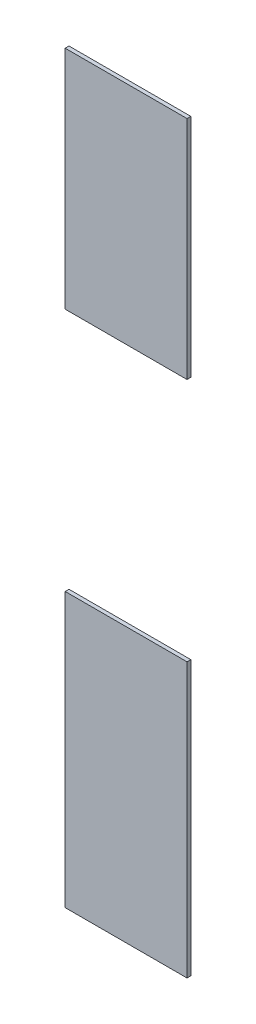
ISO-10303-21;
HEADER;
FILE_DESCRIPTION(('STEP AP214'),'2;1');
FILE_NAME('part.step','',(''),(''),'','','');
FILE_SCHEMA(('AUTOMOTIVE_DESIGN { 1 0 10303 214 1 1 1 1 }'));
ENDSEC;
DATA;
#1=APPLICATION_CONTEXT('core data for automotive mechanical design processes');
#2=APPLICATION_PROTOCOL_DEFINITION('international standard','automotive_design',2000,#1);
#3=PRODUCT_CONTEXT('',#1,'mechanical');
#4=PRODUCT('Part','Part','',(#3));
#5=PRODUCT_RELATED_PRODUCT_CATEGORY('part','',(#4));
#6=PRODUCT_DEFINITION_FORMATION('','',#4);
#7=PRODUCT_DEFINITION_CONTEXT('part definition',#1,'design');
#8=PRODUCT_DEFINITION('design','',#6,#7);
#9=PRODUCT_DEFINITION_SHAPE('','',#8);
#10=(LENGTH_UNIT() NAMED_UNIT(*) SI_UNIT(.MILLI.,.METRE.));
#11=(NAMED_UNIT(*) PLANE_ANGLE_UNIT() SI_UNIT($,.RADIAN.));
#12=(NAMED_UNIT(*) SI_UNIT($,.STERADIAN.) SOLID_ANGLE_UNIT());
#13=UNCERTAINTY_MEASURE_WITH_UNIT(LENGTH_MEASURE(1.E-05),#10,'distance_accuracy_value','');
#14=(GEOMETRIC_REPRESENTATION_CONTEXT(3) GLOBAL_UNCERTAINTY_ASSIGNED_CONTEXT((#13)) GLOBAL_UNIT_ASSIGNED_CONTEXT((#10,
#11,#12)) REPRESENTATION_CONTEXT('',''));
#15=CARTESIAN_POINT('',(0.,0.,0.));
#16=DIRECTION('',(0.,0.,1.));
#17=DIRECTION('',(1.,0.,0.));
#18=AXIS2_PLACEMENT_3D('',#15,#16,#17);
#19=CARTESIAN_POINT('',(-5.87409612295441E-13,-2444.25,12.5));
#20=DIRECTION('',(1.,0.,0.));
#21=DIRECTION('',(0.,1.,0.));
#22=AXIS2_PLACEMENT_3D('',#19,#20,#21);
#23=PLANE('',#22);
#24=DIRECTION('',(0.,-1.,0.));
#25=VECTOR('',#24,1.);
#26=CARTESIAN_POINT('',(-5.87409612295441E-13,-2444.25,0.));
#27=LINE('',#26,#25);
#28=CARTESIAN_POINT('',(-3.02914962235245E-13,-1545.,0.));
#29=VERTEX_POINT('',#28);
#30=CARTESIAN_POINT('',(-5.87409612295441E-13,-2444.25,0.));
#31=VERTEX_POINT('',#30);
#32=EDGE_CURVE('E107',#29,#31,#27,.T.);
#33=ORIENTED_EDGE('',*,*,#32,.T.);
#34=DIRECTION('',(0.,0.,-1.));
#35=VECTOR('',#34,1.);
#36=CARTESIAN_POINT('',(-5.87409612295441E-13,-2444.25,12.5));
#37=LINE('',#36,#35);
#38=CARTESIAN_POINT('',(-5.87409612295441E-13,-2444.25,12.5));
#39=VERTEX_POINT('',#38);
#40=EDGE_CURVE('E12',#39,#31,#37,.T.);
#41=ORIENTED_EDGE('',*,*,#40,.F.);
#42=DIRECTION('',(0.,-1.,0.));
#43=VECTOR('',#42,1.);
#44=CARTESIAN_POINT('',(-5.87409612295441E-13,-2444.25,12.5));
#45=LINE('',#44,#43);
#46=CARTESIAN_POINT('',(-3.02914962235245E-13,-1545.,12.5));
#47=VERTEX_POINT('',#46);
#48=EDGE_CURVE('E95',#47,#39,#45,.T.);
#49=ORIENTED_EDGE('',*,*,#48,.F.);
#50=DIRECTION('',(0.,0.,-1.));
#51=VECTOR('',#50,1.);
#52=CARTESIAN_POINT('',(-3.02914962235245E-13,-1545.,12.5));
#53=LINE('',#52,#51);
#54=EDGE_CURVE('E103',#47,#29,#53,.T.);
#55=ORIENTED_EDGE('',*,*,#54,.T.);
#56=EDGE_LOOP('',(#33,#41,#49,#55));
#57=FACE_BOUND('',#56,.T.);
#58=ADVANCED_FACE('F44',(#57),#23,.F.);
#59=CARTESIAN_POINT('',(-5.87409612295441E-13,-2444.25,12.5));
#60=DIRECTION('',(0.,1.,0.));
#61=DIRECTION('',(0.,0.,1.));
#62=AXIS2_PLACEMENT_3D('',#59,#60,#61);
#63=PLANE('',#62);
#64=DIRECTION('',(1.,0.,0.));
#65=VECTOR('',#64,1.);
#66=CARTESIAN_POINT('',(-5.87409612295441E-13,-2444.25,0.));
#67=LINE('',#66,#65);
#68=CARTESIAN_POINT('',(400.,-2444.25,0.));
#69=VERTEX_POINT('',#68);
#70=EDGE_CURVE('E99',#31,#69,#67,.T.);
#71=ORIENTED_EDGE('',*,*,#70,.T.);
#72=DIRECTION('',(0.,0.,-1.));
#73=VECTOR('',#72,1.);
#74=CARTESIAN_POINT('',(400.,-2444.25,12.5));
#75=LINE('',#74,#73);
#76=CARTESIAN_POINT('',(400.,-2444.25,12.5));
#77=VERTEX_POINT('',#76);
#78=EDGE_CURVE('E52',#77,#69,#75,.T.);
#79=ORIENTED_EDGE('',*,*,#78,.F.);
#80=DIRECTION('',(1.,0.,0.));
#81=VECTOR('',#80,1.);
#82=CARTESIAN_POINT('',(-5.87409612295441E-13,-2444.25,12.5));
#83=LINE('',#82,#81);
#84=EDGE_CURVE('E90',#39,#77,#83,.T.);
#85=ORIENTED_EDGE('',*,*,#84,.F.);
#86=ORIENTED_EDGE('',*,*,#40,.T.);
#87=EDGE_LOOP('',(#71,#79,#85,#86));
#88=FACE_BOUND('',#87,.T.);
#89=ADVANCED_FACE('F98',(#88),#63,.F.);
#90=CARTESIAN_POINT('',(400.,-2444.25,12.5));
#91=DIRECTION('',(-1.,0.,0.));
#92=DIRECTION('',(0.,0.,1.));
#93=AXIS2_PLACEMENT_3D('',#90,#91,#92);
#94=PLANE('',#93);
#95=DIRECTION('',(0.,1.,0.));
#96=VECTOR('',#95,1.);
#97=CARTESIAN_POINT('',(400.,-2444.25,0.));
#98=LINE('',#97,#96);
#99=CARTESIAN_POINT('',(400.,-1545.,0.));
#100=VERTEX_POINT('',#99);
#101=EDGE_CURVE('E77',#69,#100,#98,.T.);
#102=ORIENTED_EDGE('',*,*,#101,.T.);
#103=DIRECTION('',(0.,0.,-1.));
#104=VECTOR('',#103,1.);
#105=CARTESIAN_POINT('',(400.,-1545.,12.5));
#106=LINE('',#105,#104);
#107=CARTESIAN_POINT('',(400.,-1545.,12.5));
#108=VERTEX_POINT('',#107);
#109=EDGE_CURVE('E100',#108,#100,#106,.T.);
#110=ORIENTED_EDGE('',*,*,#109,.F.);
#111=DIRECTION('',(0.,1.,0.));
#112=VECTOR('',#111,1.);
#113=CARTESIAN_POINT('',(400.,-2444.25,12.5));
#114=LINE('',#113,#112);
#115=EDGE_CURVE('E93',#77,#108,#114,.T.);
#116=ORIENTED_EDGE('',*,*,#115,.F.);
#117=ORIENTED_EDGE('',*,*,#78,.T.);
#118=EDGE_LOOP('',(#102,#110,#116,#117));
#119=FACE_BOUND('',#118,.T.);
#120=ADVANCED_FACE('F101',(#119),#94,.F.);
#121=CARTESIAN_POINT('',(-3.02914962235245E-13,-1545.,12.5));
#122=DIRECTION('',(0.,-1.,0.));
#123=DIRECTION('',(0.,0.,-1.));
#124=AXIS2_PLACEMENT_3D('',#121,#122,#123);
#125=PLANE('',#124);
#126=DIRECTION('',(-1.,0.,0.));
#127=VECTOR('',#126,1.);
#128=CARTESIAN_POINT('',(-3.02914962235245E-13,-1545.,0.));
#129=LINE('',#128,#127);
#130=EDGE_CURVE('E83',#100,#29,#129,.T.);
#131=ORIENTED_EDGE('',*,*,#130,.T.);
#132=ORIENTED_EDGE('',*,*,#54,.F.);
#133=DIRECTION('',(-1.,0.,0.));
#134=VECTOR('',#133,1.);
#135=CARTESIAN_POINT('',(-3.02914962235245E-13,-1545.,12.5));
#136=LINE('',#135,#134);
#137=EDGE_CURVE('E60',#108,#47,#136,.T.);
#138=ORIENTED_EDGE('',*,*,#137,.F.);
#139=ORIENTED_EDGE('',*,*,#109,.T.);
#140=EDGE_LOOP('',(#131,#132,#138,#139));
#141=FACE_BOUND('',#140,.T.);
#142=ADVANCED_FACE('F114',(#141),#125,.F.);
#143=CARTESIAN_POINT('',(0.,0.,12.5));
#144=DIRECTION('',(0.,0.,-1.));
#145=DIRECTION('',(-1.,0.,0.));
#146=AXIS2_PLACEMENT_3D('',#143,#144,#145);
#147=PLANE('',#146);
#148=ORIENTED_EDGE('',*,*,#48,.T.);
#149=ORIENTED_EDGE('',*,*,#84,.T.);
#150=ORIENTED_EDGE('',*,*,#115,.T.);
#151=ORIENTED_EDGE('',*,*,#137,.T.);
#152=EDGE_LOOP('',(#148,#149,#150,#151));
#153=FACE_BOUND('',#152,.T.);
#154=ADVANCED_FACE('F91',(#153),#147,.F.);
#155=CARTESIAN_POINT('',(0.,0.,0.));
#156=DIRECTION('',(0.,0.,-1.));
#157=DIRECTION('',(-1.,0.,0.));
#158=AXIS2_PLACEMENT_3D('',#155,#156,#157);
#159=PLANE('',#158);
#160=ORIENTED_EDGE('',*,*,#32,.F.);
#161=ORIENTED_EDGE('',*,*,#130,.F.);
#162=ORIENTED_EDGE('',*,*,#101,.F.);
#163=ORIENTED_EDGE('',*,*,#70,.F.);
#164=EDGE_LOOP('',(#160,#161,#162,#163));
#165=FACE_BOUND('',#164,.T.);
#166=ADVANCED_FACE('F117',(#165),#159,.T.);
#167=CLOSED_SHELL('',(#58,#89,#120,#142,#154,#166));
#168=MANIFOLD_SOLID_BREP('B2',#167);
#169=CARTESIAN_POINT('',(0.,0.,12.5));
#170=DIRECTION('',(1.,0.,0.));
#171=DIRECTION('',(0.,1.,0.));
#172=AXIS2_PLACEMENT_3D('',#169,#170,#171);
#173=PLANE('',#172);
#174=DIRECTION('',(0.,-1.,0.));
#175=VECTOR('',#174,1.);
#176=CARTESIAN_POINT('',(0.,0.,0.));
#177=LINE('',#176,#175);
#178=CARTESIAN_POINT('',(0.,0.,0.));
#179=VERTEX_POINT('',#178);
#180=CARTESIAN_POINT('',(0.,-742.249999999999,0.));
#181=VERTEX_POINT('',#180);
#182=EDGE_CURVE('E230',#179,#181,#177,.T.);
#183=ORIENTED_EDGE('',*,*,#182,.T.);
#184=DIRECTION('',(0.,0.,-1.));
#185=VECTOR('',#184,1.);
#186=CARTESIAN_POINT('',(0.,-742.249999999999,12.5));
#187=LINE('',#186,#185);
#188=CARTESIAN_POINT('',(0.,-742.249999999999,12.5));
#189=VERTEX_POINT('',#188);
#190=EDGE_CURVE('E42',#189,#181,#187,.T.);
#191=ORIENTED_EDGE('',*,*,#190,.F.);
#192=DIRECTION('',(0.,-1.,0.));
#193=VECTOR('',#192,1.);
#194=CARTESIAN_POINT('',(0.,0.,12.5));
#195=LINE('',#194,#193);
#196=CARTESIAN_POINT('',(0.,0.,12.5));
#197=VERTEX_POINT('',#196);
#198=EDGE_CURVE('E218',#197,#189,#195,.T.);
#199=ORIENTED_EDGE('',*,*,#198,.F.);
#200=DIRECTION('',(0.,0.,-1.));
#201=VECTOR('',#200,1.);
#202=CARTESIAN_POINT('',(0.,0.,12.5));
#203=LINE('',#202,#201);
#204=EDGE_CURVE('E226',#197,#179,#203,.T.);
#205=ORIENTED_EDGE('',*,*,#204,.T.);
#206=EDGE_LOOP('',(#183,#191,#199,#205));
#207=FACE_BOUND('',#206,.T.);
#208=ADVANCED_FACE('F167',(#207),#173,.F.);
#209=CARTESIAN_POINT('',(0.,-742.249999999999,12.5));
#210=DIRECTION('',(0.,1.,0.));
#211=DIRECTION('',(0.,0.,1.));
#212=AXIS2_PLACEMENT_3D('',#209,#210,#211);
#213=PLANE('',#212);
#214=DIRECTION('',(1.,0.,0.));
#215=VECTOR('',#214,1.);
#216=CARTESIAN_POINT('',(0.,-742.249999999999,0.));
#217=LINE('',#216,#215);
#218=CARTESIAN_POINT('',(399.999999999999,-742.249999999999,0.));
#219=VERTEX_POINT('',#218);
#220=EDGE_CURVE('E222',#181,#219,#217,.T.);
#221=ORIENTED_EDGE('',*,*,#220,.T.);
#222=DIRECTION('',(0.,0.,-1.));
#223=VECTOR('',#222,1.);
#224=CARTESIAN_POINT('',(399.999999999999,-742.249999999999,12.5));
#225=LINE('',#224,#223);
#226=CARTESIAN_POINT('',(399.999999999999,-742.249999999999,12.5));
#227=VERTEX_POINT('',#226);
#228=EDGE_CURVE('E175',#227,#219,#225,.T.);
#229=ORIENTED_EDGE('',*,*,#228,.F.);
#230=DIRECTION('',(1.,0.,0.));
#231=VECTOR('',#230,1.);
#232=CARTESIAN_POINT('',(0.,-742.249999999999,12.5));
#233=LINE('',#232,#231);
#234=EDGE_CURVE('E213',#189,#227,#233,.T.);
#235=ORIENTED_EDGE('',*,*,#234,.F.);
#236=ORIENTED_EDGE('',*,*,#190,.T.);
#237=EDGE_LOOP('',(#221,#229,#235,#236));
#238=FACE_BOUND('',#237,.T.);
#239=ADVANCED_FACE('F221',(#238),#213,.F.);
#240=CARTESIAN_POINT('',(400.,0.,12.5));
#241=DIRECTION('',(-1.,0.,0.));
#242=DIRECTION('',(0.,-1.,0.));
#243=AXIS2_PLACEMENT_3D('',#240,#241,#242);
#244=PLANE('',#243);
#245=DIRECTION('',(0.,1.,0.));
#246=VECTOR('',#245,1.);
#247=CARTESIAN_POINT('',(400.,0.,0.));
#248=LINE('',#247,#246);
#249=CARTESIAN_POINT('',(400.,0.,0.));
#250=VERTEX_POINT('',#249);
#251=EDGE_CURVE('E200',#219,#250,#248,.T.);
#252=ORIENTED_EDGE('',*,*,#251,.T.);
#253=DIRECTION('',(0.,0.,-1.));
#254=VECTOR('',#253,1.);
#255=CARTESIAN_POINT('',(400.,0.,12.5));
#256=LINE('',#255,#254);
#257=CARTESIAN_POINT('',(400.,0.,12.5));
#258=VERTEX_POINT('',#257);
#259=EDGE_CURVE('E223',#258,#250,#256,.T.);
#260=ORIENTED_EDGE('',*,*,#259,.F.);
#261=DIRECTION('',(0.,1.,0.));
#262=VECTOR('',#261,1.);
#263=CARTESIAN_POINT('',(400.,0.,12.5));
#264=LINE('',#263,#262);
#265=EDGE_CURVE('E216',#227,#258,#264,.T.);
#266=ORIENTED_EDGE('',*,*,#265,.F.);
#267=ORIENTED_EDGE('',*,*,#228,.T.);
#268=EDGE_LOOP('',(#252,#260,#266,#267));
#269=FACE_BOUND('',#268,.T.);
#270=ADVANCED_FACE('F224',(#269),#244,.F.);
#271=CARTESIAN_POINT('',(0.,0.,12.5));
#272=DIRECTION('',(0.,-1.,0.));
#273=DIRECTION('',(0.,0.,-1.));
#274=AXIS2_PLACEMENT_3D('',#271,#272,#273);
#275=PLANE('',#274);
#276=DIRECTION('',(-1.,0.,0.));
#277=VECTOR('',#276,1.);
#278=CARTESIAN_POINT('',(0.,0.,0.));
#279=LINE('',#278,#277);
#280=EDGE_CURVE('E206',#250,#179,#279,.T.);
#281=ORIENTED_EDGE('',*,*,#280,.T.);
#282=ORIENTED_EDGE('',*,*,#204,.F.);
#283=DIRECTION('',(-1.,0.,0.));
#284=VECTOR('',#283,1.);
#285=CARTESIAN_POINT('',(0.,0.,12.5));
#286=LINE('',#285,#284);
#287=EDGE_CURVE('E183',#258,#197,#286,.T.);
#288=ORIENTED_EDGE('',*,*,#287,.F.);
#289=ORIENTED_EDGE('',*,*,#259,.T.);
#290=EDGE_LOOP('',(#281,#282,#288,#289));
#291=FACE_BOUND('',#290,.T.);
#292=ADVANCED_FACE('F237',(#291),#275,.F.);
#293=CARTESIAN_POINT('',(0.,0.,12.5));
#294=DIRECTION('',(0.,0.,1.));
#295=DIRECTION('',(1.,0.,0.));
#296=AXIS2_PLACEMENT_3D('',#293,#294,#295);
#297=PLANE('',#296);
#298=ORIENTED_EDGE('',*,*,#198,.T.);
#299=ORIENTED_EDGE('',*,*,#234,.T.);
#300=ORIENTED_EDGE('',*,*,#265,.T.);
#301=ORIENTED_EDGE('',*,*,#287,.T.);
#302=EDGE_LOOP('',(#298,#299,#300,#301));
#303=FACE_BOUND('',#302,.T.);
#304=ADVANCED_FACE('F214',(#303),#297,.T.);
#305=CARTESIAN_POINT('',(0.,0.,0.));
#306=DIRECTION('',(0.,0.,1.));
#307=DIRECTION('',(1.,0.,0.));
#308=AXIS2_PLACEMENT_3D('',#305,#306,#307);
#309=PLANE('',#308);
#310=ORIENTED_EDGE('',*,*,#182,.F.);
#311=ORIENTED_EDGE('',*,*,#280,.F.);
#312=ORIENTED_EDGE('',*,*,#251,.F.);
#313=ORIENTED_EDGE('',*,*,#220,.F.);
#314=EDGE_LOOP('',(#310,#311,#312,#313));
#315=FACE_BOUND('',#314,.T.);
#316=ADVANCED_FACE('F240',(#315),#309,.F.);
#317=CLOSED_SHELL('',(#208,#239,#270,#292,#304,#316));
#318=MANIFOLD_SOLID_BREP('B6',#317);
#319=ADVANCED_BREP_SHAPE_REPRESENTATION('',(#18,#168,#318),#14);
#320=SHAPE_DEFINITION_REPRESENTATION(#9,#319);
ENDSEC;
END-ISO-10303-21;
